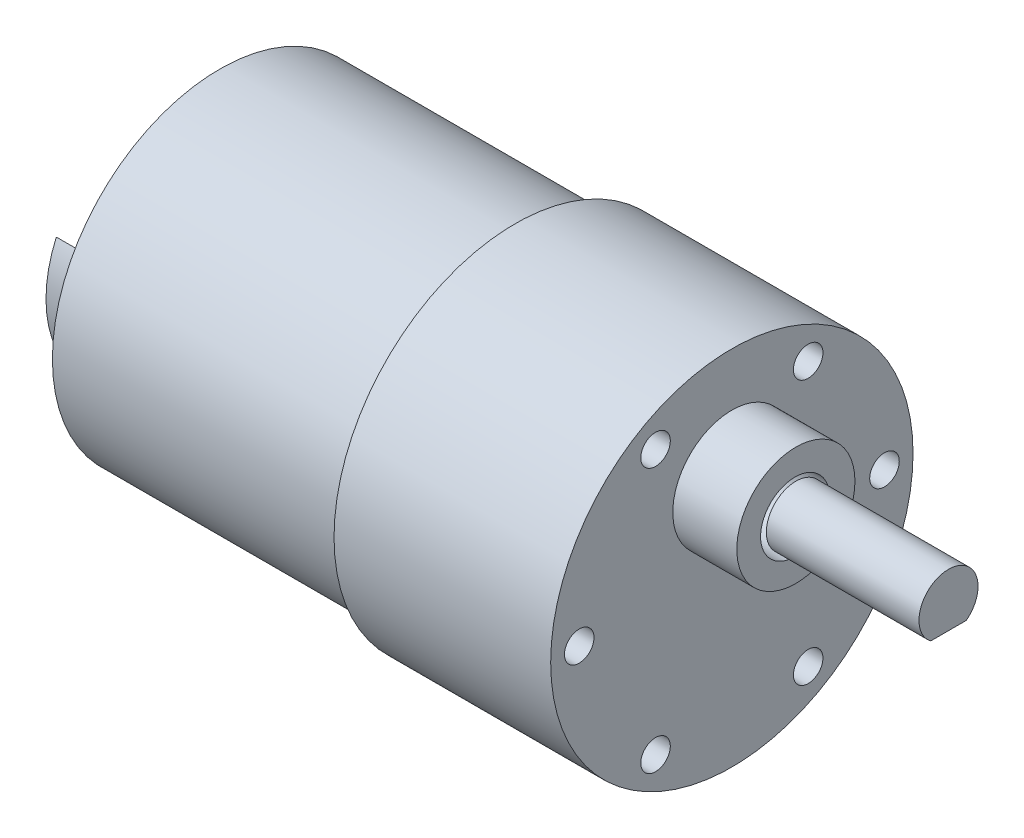
ISO-10303-21;
HEADER;
FILE_DESCRIPTION(('STEP AP214'),'2;1');
FILE_NAME('part.step','',(''),(''),'','','');
FILE_SCHEMA(('AUTOMOTIVE_DESIGN { 1 0 10303 214 1 1 1 1 }'));
ENDSEC;
DATA;
#1=APPLICATION_CONTEXT('core data for automotive mechanical design processes');
#2=APPLICATION_PROTOCOL_DEFINITION('international standard','automotive_design',2000,#1);
#3=PRODUCT_CONTEXT('',#1,'mechanical');
#4=PRODUCT('Part','Part','',(#3));
#5=PRODUCT_RELATED_PRODUCT_CATEGORY('part','',(#4));
#6=PRODUCT_DEFINITION_FORMATION('','',#4);
#7=PRODUCT_DEFINITION_CONTEXT('part definition',#1,'design');
#8=PRODUCT_DEFINITION('design','',#6,#7);
#9=PRODUCT_DEFINITION_SHAPE('','',#8);
#10=(LENGTH_UNIT() NAMED_UNIT(*) SI_UNIT(.MILLI.,.METRE.));
#11=(NAMED_UNIT(*) PLANE_ANGLE_UNIT() SI_UNIT($,.RADIAN.));
#12=(NAMED_UNIT(*) SI_UNIT($,.STERADIAN.) SOLID_ANGLE_UNIT());
#13=UNCERTAINTY_MEASURE_WITH_UNIT(LENGTH_MEASURE(1.E-05),#10,'distance_accuracy_value','');
#14=(GEOMETRIC_REPRESENTATION_CONTEXT(3) GLOBAL_UNCERTAINTY_ASSIGNED_CONTEXT((#13)) GLOBAL_UNIT_ASSIGNED_CONTEXT((#10,
#11,#12)) REPRESENTATION_CONTEXT('',''));
#15=CARTESIAN_POINT('',(0.,0.,0.));
#16=DIRECTION('',(0.,0.,1.));
#17=DIRECTION('',(1.,0.,0.));
#18=AXIS2_PLACEMENT_3D('',#15,#16,#17);
#19=CARTESIAN_POINT('',(6.5,7.,0.));
#20=DIRECTION('',(1.,0.,0.));
#21=DIRECTION('',(0.,0.,-1.));
#22=AXIS2_PLACEMENT_3D('',#19,#20,#21);
#23=PLANE('',#22);
#24=CARTESIAN_POINT('',(6.5,6.90910007875445,0.0865258299453942));
#25=DIRECTION('',(1.,0.,0.));
#26=DIRECTION('',(0.,0.,-1.));
#27=AXIS2_PLACEMENT_3D('',#24,#25,#26);
#28=CIRCLE('',#27,3.5);
#29=CARTESIAN_POINT('',(6.5,6.90910007875445,-3.41347417005461));
#30=VERTEX_POINT('',#29);
#31=EDGE_CURVE('E54',#30,#30,#28,.T.);
#32=ORIENTED_EDGE('',*,*,#31,.F.);
#33=EDGE_LOOP('',(#32));
#34=FACE_BOUND('',#33,.T.);
#35=CARTESIAN_POINT('',(6.5,7.,0.));
#36=DIRECTION('',(1.,0.,0.));
#37=DIRECTION('',(0.,0.,-1.));
#38=AXIS2_PLACEMENT_3D('',#35,#36,#37);
#39=CIRCLE('',#38,6.);
#40=CARTESIAN_POINT('',(6.5,7.,-6.));
#41=VERTEX_POINT('',#40);
#42=EDGE_CURVE('E131',#41,#41,#39,.T.);
#43=ORIENTED_EDGE('',*,*,#42,.T.);
#44=EDGE_LOOP('',(#43));
#45=FACE_BOUND('',#44,.T.);
#46=ADVANCED_FACE('F45',(#34,#45),#23,.T.);
#47=CARTESIAN_POINT('',(0.,0.,0.));
#48=DIRECTION('',(1.,0.,0.));
#49=DIRECTION('',(0.,0.,-1.));
#50=AXIS2_PLACEMENT_3D('',#47,#48,#49);
#51=PLANE('',#50);
#52=CARTESIAN_POINT('',(0.,0.,-15.5));
#53=DIRECTION('',(1.,0.,0.));
#54=DIRECTION('',(0.,0.,-1.));
#55=AXIS2_PLACEMENT_3D('',#52,#53,#54);
#56=CIRCLE('',#55,1.49999999999999);
#57=CARTESIAN_POINT('',(0.,0.,-17.));
#58=VERTEX_POINT('',#57);
#59=EDGE_CURVE('E166',#58,#58,#56,.T.);
#60=ORIENTED_EDGE('',*,*,#59,.F.);
#61=EDGE_LOOP('',(#60));
#62=FACE_BOUND('',#61,.T.);
#63=CARTESIAN_POINT('',(0.,-13.4233937586588,7.75));
#64=DIRECTION('',(1.,0.,0.));
#65=DIRECTION('',(0.,0.,-1.));
#66=AXIS2_PLACEMENT_3D('',#63,#64,#65);
#67=CIRCLE('',#66,1.49999999999999);
#68=CARTESIAN_POINT('',(0.,-13.4233937586588,6.25000000000001));
#69=VERTEX_POINT('',#68);
#70=EDGE_CURVE('E160',#69,#69,#67,.T.);
#71=ORIENTED_EDGE('',*,*,#70,.F.);
#72=EDGE_LOOP('',(#71));
#73=FACE_BOUND('',#72,.T.);
#74=CARTESIAN_POINT('',(0.,13.4233937586588,7.74999999999999));
#75=DIRECTION('',(1.,0.,0.));
#76=DIRECTION('',(0.,0.,-1.));
#77=AXIS2_PLACEMENT_3D('',#74,#75,#76);
#78=CIRCLE('',#77,1.49999999999999);
#79=CARTESIAN_POINT('',(0.,13.4233937586588,6.25));
#80=VERTEX_POINT('',#79);
#81=EDGE_CURVE('E154',#80,#80,#78,.T.);
#82=ORIENTED_EDGE('',*,*,#81,.F.);
#83=EDGE_LOOP('',(#82));
#84=FACE_BOUND('',#83,.T.);
#85=CARTESIAN_POINT('',(0.,-13.4233937586588,-7.75));
#86=DIRECTION('',(1.,0.,0.));
#87=DIRECTION('',(0.,0.,-1.));
#88=AXIS2_PLACEMENT_3D('',#85,#86,#87);
#89=CIRCLE('',#88,1.49999999999999);
#90=CARTESIAN_POINT('',(0.,-13.4233937586588,-9.24999999999999));
#91=VERTEX_POINT('',#90);
#92=EDGE_CURVE('E148',#91,#91,#89,.T.);
#93=ORIENTED_EDGE('',*,*,#92,.F.);
#94=EDGE_LOOP('',(#93));
#95=FACE_BOUND('',#94,.T.);
#96=CARTESIAN_POINT('',(0.,13.4233937586588,-7.75000000000001));
#97=DIRECTION('',(1.,0.,0.));
#98=DIRECTION('',(0.,0.,-1.));
#99=AXIS2_PLACEMENT_3D('',#96,#97,#98);
#100=CIRCLE('',#99,1.49999999999999);
#101=CARTESIAN_POINT('',(0.,13.4233937586588,-9.25));
#102=VERTEX_POINT('',#101);
#103=EDGE_CURVE('E142',#102,#102,#100,.T.);
#104=ORIENTED_EDGE('',*,*,#103,.F.);
#105=EDGE_LOOP('',(#104));
#106=FACE_BOUND('',#105,.T.);
#107=CARTESIAN_POINT('',(0.,0.,15.5));
#108=DIRECTION('',(1.,0.,0.));
#109=DIRECTION('',(0.,0.,-1.));
#110=AXIS2_PLACEMENT_3D('',#107,#108,#109);
#111=CIRCLE('',#110,1.49999999999999);
#112=CARTESIAN_POINT('',(0.,0.,14.));
#113=VERTEX_POINT('',#112);
#114=EDGE_CURVE('E136',#113,#113,#111,.T.);
#115=ORIENTED_EDGE('',*,*,#114,.F.);
#116=EDGE_LOOP('',(#115));
#117=FACE_BOUND('',#116,.T.);
#118=CARTESIAN_POINT('',(0.,0.,0.));
#119=DIRECTION('',(1.,0.,0.));
#120=DIRECTION('',(0.,0.,-1.));
#121=AXIS2_PLACEMENT_3D('',#118,#119,#120);
#122=CIRCLE('',#121,18.4);
#123=CARTESIAN_POINT('',(0.,0.,-18.4));
#124=VERTEX_POINT('',#123);
#125=EDGE_CURVE('E117',#124,#124,#122,.T.);
#126=ORIENTED_EDGE('',*,*,#125,.T.);
#127=EDGE_LOOP('',(#126));
#128=FACE_BOUND('',#127,.T.);
#129=CARTESIAN_POINT('',(0.,7.,0.));
#130=DIRECTION('',(1.,0.,0.));
#131=DIRECTION('',(0.,0.,-1.));
#132=AXIS2_PLACEMENT_3D('',#129,#130,#131);
#133=CIRCLE('',#132,6.);
#134=CARTESIAN_POINT('',(0.,7.,-6.));
#135=VERTEX_POINT('',#134);
#136=EDGE_CURVE('E126',#135,#135,#133,.T.);
#137=ORIENTED_EDGE('',*,*,#136,.F.);
#138=EDGE_LOOP('',(#137));
#139=FACE_BOUND('',#138,.T.);
#140=ADVANCED_FACE('F175',(#62,#73,#84,#95,#106,#117,#128,#139),#51,.T.);
#141=CARTESIAN_POINT('',(-53.,0.,0.));
#142=DIRECTION('',(-1.,0.,0.));
#143=DIRECTION('',(0.,0.,1.));
#144=AXIS2_PLACEMENT_3D('',#141,#142,#143);
#145=PLANE('',#144);
#146=CARTESIAN_POINT('',(-53.,0.,0.));
#147=DIRECTION('',(-1.,0.,0.));
#148=DIRECTION('',(0.,0.,1.));
#149=AXIS2_PLACEMENT_3D('',#146,#147,#148);
#150=CIRCLE('',#149,12.05);
#151=CARTESIAN_POINT('',(-53.,4.91960364257121,11.));
#152=VERTEX_POINT('',#151);
#153=CARTESIAN_POINT('',(-53.,4.9196036425712,-11.));
#154=VERTEX_POINT('',#153);
#155=EDGE_CURVE('E114',#152,#154,#150,.T.);
#156=ORIENTED_EDGE('',*,*,#155,.T.);
#157=DIRECTION('',(0.,1.,0.));
#158=VECTOR('',#157,1.);
#159=CARTESIAN_POINT('',(-53.,4.9196036425712,-11.));
#160=LINE('',#159,#158);
#161=CARTESIAN_POINT('',(-53.,-4.91960364257119,-11.));
#162=VERTEX_POINT('',#161);
#163=EDGE_CURVE('E92',#162,#154,#160,.T.);
#164=ORIENTED_EDGE('',*,*,#163,.F.);
#165=CARTESIAN_POINT('',(-53.,-4.91960364257122,11.));
#166=VERTEX_POINT('',#165);
#167=EDGE_CURVE('E113',#162,#166,#150,.T.);
#168=ORIENTED_EDGE('',*,*,#167,.T.);
#169=DIRECTION('',(0.,1.,0.));
#170=VECTOR('',#169,1.);
#171=CARTESIAN_POINT('',(-53.,-4.91960364257122,11.));
#172=LINE('',#171,#170);
#173=EDGE_CURVE('E88',#166,#152,#172,.T.);
#174=ORIENTED_EDGE('',*,*,#173,.T.);
#175=EDGE_LOOP('',(#156,#164,#168,#174));
#176=FACE_BOUND('',#175,.T.);
#177=ADVANCED_FACE('F188',(#176),#145,.T.);
#178=CARTESIAN_POINT('',(-52.,0.,0.));
#179=DIRECTION('',(-1.,0.,0.));
#180=DIRECTION('',(0.,0.,1.));
#181=AXIS2_PLACEMENT_3D('',#178,#179,#180);
#182=PLANE('',#181);
#183=CARTESIAN_POINT('',(-52.,0.,0.));
#184=DIRECTION('',(-1.,0.,0.));
#185=DIRECTION('',(0.,0.,1.));
#186=AXIS2_PLACEMENT_3D('',#183,#184,#185);
#187=CIRCLE('',#186,17.);
#188=CARTESIAN_POINT('',(-52.,0.,17.));
#189=VERTEX_POINT('',#188);
#190=EDGE_CURVE('E112',#189,#189,#187,.T.);
#191=ORIENTED_EDGE('',*,*,#190,.T.);
#192=EDGE_LOOP('',(#191));
#193=FACE_BOUND('',#192,.T.);
#194=CARTESIAN_POINT('',(-52.,0.,0.));
#195=DIRECTION('',(-1.,0.,0.));
#196=DIRECTION('',(0.,0.,1.));
#197=AXIS2_PLACEMENT_3D('',#194,#195,#196);
#198=CIRCLE('',#197,12.05);
#199=CARTESIAN_POINT('',(-52.,0.,12.05));
#200=VERTEX_POINT('',#199);
#201=EDGE_CURVE('E103',#200,#200,#198,.T.);
#202=ORIENTED_EDGE('',*,*,#201,.F.);
#203=EDGE_LOOP('',(#202));
#204=FACE_BOUND('',#203,.T.);
#205=ADVANCED_FACE('F194',(#193,#204),#182,.T.);
#206=CARTESIAN_POINT('',(-22.,18.4,0.));
#207=DIRECTION('',(-1.,0.,0.));
#208=DIRECTION('',(0.,0.,1.));
#209=AXIS2_PLACEMENT_3D('',#206,#207,#208);
#210=PLANE('',#209);
#211=CARTESIAN_POINT('',(-22.,0.,0.));
#212=DIRECTION('',(1.,0.,0.));
#213=DIRECTION('',(0.,0.,-1.));
#214=AXIS2_PLACEMENT_3D('',#211,#212,#213);
#215=CIRCLE('',#214,18.4);
#216=CARTESIAN_POINT('',(-22.,0.,-18.4));
#217=VERTEX_POINT('',#216);
#218=EDGE_CURVE('E442',#217,#217,#215,.T.);
#219=ORIENTED_EDGE('',*,*,#218,.F.);
#220=EDGE_LOOP('',(#219));
#221=FACE_BOUND('',#220,.T.);
#222=CARTESIAN_POINT('',(-22.,0.,0.));
#223=DIRECTION('',(-1.,0.,0.));
#224=DIRECTION('',(0.,0.,1.));
#225=AXIS2_PLACEMENT_3D('',#222,#223,#224);
#226=CIRCLE('',#225,17.);
#227=CARTESIAN_POINT('',(-22.,0.,17.));
#228=VERTEX_POINT('',#227);
#229=EDGE_CURVE('E123',#228,#228,#226,.T.);
#230=ORIENTED_EDGE('',*,*,#229,.F.);
#231=EDGE_LOOP('',(#230));
#232=FACE_BOUND('',#231,.T.);
#233=ADVANCED_FACE('F201',(#221,#232),#210,.T.);
#234=CARTESIAN_POINT('',(-22.,0.,0.));
#235=DIRECTION('',(1.,0.,0.));
#236=DIRECTION('',(0.,0.,-1.));
#237=AXIS2_PLACEMENT_3D('',#234,#235,#236);
#238=CYLINDRICAL_SURFACE('',#237,18.4);
#239=ORIENTED_EDGE('',*,*,#218,.T.);
#240=EDGE_LOOP('',(#239));
#241=FACE_BOUND('',#240,.T.);
#242=ORIENTED_EDGE('',*,*,#125,.F.);
#243=EDGE_LOOP('',(#242));
#244=FACE_BOUND('',#243,.T.);
#245=ADVANCED_FACE('F206',(#241,#244),#238,.T.);
#246=CARTESIAN_POINT('',(-52.,0.,0.));
#247=DIRECTION('',(1.,0.,0.));
#248=DIRECTION('',(0.,0.,-1.));
#249=AXIS2_PLACEMENT_3D('',#246,#247,#248);
#250=CYLINDRICAL_SURFACE('',#249,17.);
#251=ORIENTED_EDGE('',*,*,#190,.F.);
#252=EDGE_LOOP('',(#251));
#253=FACE_BOUND('',#252,.T.);
#254=ORIENTED_EDGE('',*,*,#229,.T.);
#255=EDGE_LOOP('',(#254));
#256=FACE_BOUND('',#255,.T.);
#257=ADVANCED_FACE('F203',(#253,#256),#250,.T.);
#258=CARTESIAN_POINT('',(-57.6,0.,0.));
#259=DIRECTION('',(1.,0.,0.));
#260=DIRECTION('',(0.,0.,-1.));
#261=AXIS2_PLACEMENT_3D('',#258,#259,#260);
#262=CYLINDRICAL_SURFACE('',#261,12.05);
#263=CARTESIAN_POINT('',(-57.6,0.,0.));
#264=DIRECTION('',(-1.,0.,0.));
#265=DIRECTION('',(0.,0.,1.));
#266=AXIS2_PLACEMENT_3D('',#263,#264,#265);
#267=CIRCLE('',#266,12.05);
#268=CARTESIAN_POINT('',(-57.6,-4.91960364257122,11.));
#269=VERTEX_POINT('',#268);
#270=CARTESIAN_POINT('',(-57.6,4.91960364257121,11.));
#271=VERTEX_POINT('',#270);
#272=EDGE_CURVE('E97',#269,#271,#267,.T.);
#273=ORIENTED_EDGE('',*,*,#272,.F.);
#274=DIRECTION('',(-1.,0.,0.));
#275=VECTOR('',#274,1.);
#276=CARTESIAN_POINT('',(-53.,-4.91960364257122,11.));
#277=LINE('',#276,#275);
#278=EDGE_CURVE('E82',#166,#269,#277,.T.);
#279=ORIENTED_EDGE('',*,*,#278,.F.);
#280=ORIENTED_EDGE('',*,*,#167,.F.);
#281=DIRECTION('',(1.,0.,0.));
#282=VECTOR('',#281,1.);
#283=CARTESIAN_POINT('',(-57.6,-4.9196036425712,-11.));
#284=LINE('',#283,#282);
#285=CARTESIAN_POINT('',(-57.6,-4.9196036425712,-11.));
#286=VERTEX_POINT('',#285);
#287=EDGE_CURVE('E118',#286,#162,#284,.T.);
#288=ORIENTED_EDGE('',*,*,#287,.F.);
#289=CARTESIAN_POINT('',(-57.6,0.,0.));
#290=DIRECTION('',(-1.,0.,0.));
#291=DIRECTION('',(0.,0.,-1.));
#292=AXIS2_PLACEMENT_3D('',#289,#290,#291);
#293=CIRCLE('',#292,12.05);
#294=CARTESIAN_POINT('',(-57.6,4.9196036425712,-11.));
#295=VERTEX_POINT('',#294);
#296=EDGE_CURVE('E120',#295,#286,#293,.T.);
#297=ORIENTED_EDGE('',*,*,#296,.F.);
#298=DIRECTION('',(1.,0.,0.));
#299=VECTOR('',#298,1.);
#300=CARTESIAN_POINT('',(-57.6,4.9196036425712,-11.));
#301=LINE('',#300,#299);
#302=EDGE_CURVE('E109',#295,#154,#301,.T.);
#303=ORIENTED_EDGE('',*,*,#302,.T.);
#304=ORIENTED_EDGE('',*,*,#155,.F.);
#305=DIRECTION('',(-1.,0.,0.));
#306=VECTOR('',#305,1.);
#307=CARTESIAN_POINT('',(-53.,4.91960364257121,11.));
#308=LINE('',#307,#306);
#309=EDGE_CURVE('E102',#152,#271,#308,.T.);
#310=ORIENTED_EDGE('',*,*,#309,.T.);
#311=EDGE_LOOP('',(#273,#279,#280,#288,#297,#303,#304,#310));
#312=FACE_BOUND('',#311,.T.);
#313=ORIENTED_EDGE('',*,*,#201,.T.);
#314=EDGE_LOOP('',(#313));
#315=FACE_BOUND('',#314,.T.);
#316=ADVANCED_FACE('F99',(#312,#315),#262,.T.);
#317=CARTESIAN_POINT('',(-57.6,0.,0.));
#318=DIRECTION('',(-1.,0.,0.));
#319=DIRECTION('',(0.,0.,1.));
#320=AXIS2_PLACEMENT_3D('',#317,#318,#319);
#321=PLANE('',#320);
#322=DIRECTION('',(0.,1.,0.));
#323=VECTOR('',#322,1.);
#324=CARTESIAN_POINT('',(-57.6,-4.91960364257122,11.));
#325=LINE('',#324,#323);
#326=EDGE_CURVE('E85',#269,#271,#325,.T.);
#327=ORIENTED_EDGE('',*,*,#326,.F.);
#328=ORIENTED_EDGE('',*,*,#272,.T.);
#329=EDGE_LOOP('',(#327,#328));
#330=FACE_BOUND('',#329,.T.);
#331=ADVANCED_FACE('F96',(#330),#321,.T.);
#332=CARTESIAN_POINT('',(-53.,-4.91960364257122,11.));
#333=DIRECTION('',(0.,0.,1.));
#334=DIRECTION('',(0.,-1.,0.));
#335=AXIS2_PLACEMENT_3D('',#332,#333,#334);
#336=PLANE('',#335);
#337=ORIENTED_EDGE('',*,*,#326,.T.);
#338=ORIENTED_EDGE('',*,*,#309,.F.);
#339=ORIENTED_EDGE('',*,*,#173,.F.);
#340=ORIENTED_EDGE('',*,*,#278,.T.);
#341=EDGE_LOOP('',(#337,#338,#339,#340));
#342=FACE_BOUND('',#341,.T.);
#343=ADVANCED_FACE('F84',(#342),#336,.F.);
#344=CARTESIAN_POINT('',(-57.6,4.9196036425712,-11.));
#345=DIRECTION('',(0.,0.,-1.));
#346=DIRECTION('',(0.,1.,0.));
#347=AXIS2_PLACEMENT_3D('',#344,#345,#346);
#348=PLANE('',#347);
#349=ORIENTED_EDGE('',*,*,#163,.T.);
#350=ORIENTED_EDGE('',*,*,#302,.F.);
#351=DIRECTION('',(0.,1.,0.));
#352=VECTOR('',#351,1.);
#353=CARTESIAN_POINT('',(-57.6,4.9196036425712,-11.));
#354=LINE('',#353,#352);
#355=EDGE_CURVE('E60',#286,#295,#354,.T.);
#356=ORIENTED_EDGE('',*,*,#355,.F.);
#357=ORIENTED_EDGE('',*,*,#287,.T.);
#358=EDGE_LOOP('',(#349,#350,#356,#357));
#359=FACE_BOUND('',#358,.T.);
#360=ADVANCED_FACE('F216',(#359),#348,.F.);
#361=CARTESIAN_POINT('',(-57.6,0.,0.));
#362=DIRECTION('',(1.,0.,0.));
#363=DIRECTION('',(0.,0.,-1.));
#364=AXIS2_PLACEMENT_3D('',#361,#362,#363);
#365=PLANE('',#364);
#366=ORIENTED_EDGE('',*,*,#296,.T.);
#367=ORIENTED_EDGE('',*,*,#355,.T.);
#368=EDGE_LOOP('',(#366,#367));
#369=FACE_BOUND('',#368,.T.);
#370=ADVANCED_FACE('F183',(#369),#365,.F.);
#371=CARTESIAN_POINT('',(6.5,7.,0.));
#372=DIRECTION('',(-1.,0.,0.));
#373=DIRECTION('',(0.,0.,1.));
#374=AXIS2_PLACEMENT_3D('',#371,#372,#373);
#375=CYLINDRICAL_SURFACE('',#374,6.);
#376=ORIENTED_EDGE('',*,*,#42,.F.);
#377=EDGE_LOOP('',(#376));
#378=FACE_BOUND('',#377,.T.);
#379=ORIENTED_EDGE('',*,*,#136,.T.);
#380=EDGE_LOOP('',(#379));
#381=FACE_BOUND('',#380,.T.);
#382=ADVANCED_FACE('F179',(#378,#381),#375,.T.);
#383=CARTESIAN_POINT('',(-4.,0.,15.5));
#384=DIRECTION('',(-1.,0.,0.));
#385=DIRECTION('',(0.,0.,1.));
#386=AXIS2_PLACEMENT_3D('',#383,#384,#385);
#387=PLANE('',#386);
#388=CARTESIAN_POINT('',(-4.,0.,15.5));
#389=DIRECTION('',(1.,0.,0.));
#390=DIRECTION('',(0.,0.,-1.));
#391=AXIS2_PLACEMENT_3D('',#388,#389,#390);
#392=CIRCLE('',#391,1.49999999999999);
#393=CARTESIAN_POINT('',(-4.,0.,14.));
#394=VERTEX_POINT('',#393);
#395=EDGE_CURVE('E130',#394,#394,#392,.T.);
#396=ORIENTED_EDGE('',*,*,#395,.T.);
#397=EDGE_LOOP('',(#396));
#398=FACE_BOUND('',#397,.T.);
#399=ADVANCED_FACE('F182',(#398),#387,.F.);
#400=CARTESIAN_POINT('',(0.,0.,15.5));
#401=DIRECTION('',(1.,0.,0.));
#402=DIRECTION('',(0.,0.,-1.));
#403=AXIS2_PLACEMENT_3D('',#400,#401,#402);
#404=CYLINDRICAL_SURFACE('',#403,1.49999999999999);
#405=ORIENTED_EDGE('',*,*,#395,.F.);
#406=EDGE_LOOP('',(#405));
#407=FACE_BOUND('',#406,.T.);
#408=ORIENTED_EDGE('',*,*,#114,.T.);
#409=EDGE_LOOP('',(#408));
#410=FACE_BOUND('',#409,.T.);
#411=ADVANCED_FACE('F225',(#407,#410),#404,.F.);
#412=CARTESIAN_POINT('',(-4.,13.4233937586588,-7.75000000000001));
#413=DIRECTION('',(-1.,0.,0.));
#414=DIRECTION('',(0.,0.,1.));
#415=AXIS2_PLACEMENT_3D('',#412,#413,#414);
#416=PLANE('',#415);
#417=CARTESIAN_POINT('',(-4.,13.4233937586588,-7.75000000000001));
#418=DIRECTION('',(1.,0.,0.));
#419=DIRECTION('',(0.,0.,-1.));
#420=AXIS2_PLACEMENT_3D('',#417,#418,#419);
#421=CIRCLE('',#420,1.49999999999999);
#422=CARTESIAN_POINT('',(-4.,13.4233937586588,-9.24999999999999));
#423=VERTEX_POINT('',#422);
#424=EDGE_CURVE('E139',#423,#423,#421,.T.);
#425=ORIENTED_EDGE('',*,*,#424,.T.);
#426=EDGE_LOOP('',(#425));
#427=FACE_BOUND('',#426,.T.);
#428=ADVANCED_FACE('F229',(#427),#416,.F.);
#429=CARTESIAN_POINT('',(0.,13.4233937586588,-7.75000000000001));
#430=DIRECTION('',(1.,0.,0.));
#431=DIRECTION('',(0.,0.,-1.));
#432=AXIS2_PLACEMENT_3D('',#429,#430,#431);
#433=CYLINDRICAL_SURFACE('',#432,1.49999999999999);
#434=ORIENTED_EDGE('',*,*,#424,.F.);
#435=EDGE_LOOP('',(#434));
#436=FACE_BOUND('',#435,.T.);
#437=ORIENTED_EDGE('',*,*,#103,.T.);
#438=EDGE_LOOP('',(#437));
#439=FACE_BOUND('',#438,.T.);
#440=ADVANCED_FACE('F233',(#436,#439),#433,.F.);
#441=CARTESIAN_POINT('',(-4.,-13.4233937586588,-7.75));
#442=DIRECTION('',(-1.,0.,0.));
#443=DIRECTION('',(0.,0.,1.));
#444=AXIS2_PLACEMENT_3D('',#441,#442,#443);
#445=PLANE('',#444);
#446=CARTESIAN_POINT('',(-4.,-13.4233937586588,-7.75));
#447=DIRECTION('',(1.,0.,0.));
#448=DIRECTION('',(0.,0.,-1.));
#449=AXIS2_PLACEMENT_3D('',#446,#447,#448);
#450=CIRCLE('',#449,1.49999999999999);
#451=CARTESIAN_POINT('',(-4.,-13.4233937586588,-9.24999999999999));
#452=VERTEX_POINT('',#451);
#453=EDGE_CURVE('E145',#452,#452,#450,.T.);
#454=ORIENTED_EDGE('',*,*,#453,.T.);
#455=EDGE_LOOP('',(#454));
#456=FACE_BOUND('',#455,.T.);
#457=ADVANCED_FACE('F237',(#456),#445,.F.);
#458=CARTESIAN_POINT('',(0.,-13.4233937586588,-7.75));
#459=DIRECTION('',(1.,0.,0.));
#460=DIRECTION('',(0.,0.,-1.));
#461=AXIS2_PLACEMENT_3D('',#458,#459,#460);
#462=CYLINDRICAL_SURFACE('',#461,1.49999999999999);
#463=ORIENTED_EDGE('',*,*,#453,.F.);
#464=EDGE_LOOP('',(#463));
#465=FACE_BOUND('',#464,.T.);
#466=ORIENTED_EDGE('',*,*,#92,.T.);
#467=EDGE_LOOP('',(#466));
#468=FACE_BOUND('',#467,.T.);
#469=ADVANCED_FACE('F241',(#465,#468),#462,.F.);
#470=CARTESIAN_POINT('',(-4.,13.4233937586588,7.74999999999999));
#471=DIRECTION('',(-1.,0.,0.));
#472=DIRECTION('',(0.,0.,1.));
#473=AXIS2_PLACEMENT_3D('',#470,#471,#472);
#474=PLANE('',#473);
#475=CARTESIAN_POINT('',(-4.,13.4233937586588,7.74999999999999));
#476=DIRECTION('',(1.,0.,0.));
#477=DIRECTION('',(0.,0.,-1.));
#478=AXIS2_PLACEMENT_3D('',#475,#476,#477);
#479=CIRCLE('',#478,1.49999999999999);
#480=CARTESIAN_POINT('',(-4.,13.4233937586588,6.25000000000001));
#481=VERTEX_POINT('',#480);
#482=EDGE_CURVE('E151',#481,#481,#479,.T.);
#483=ORIENTED_EDGE('',*,*,#482,.T.);
#484=EDGE_LOOP('',(#483));
#485=FACE_BOUND('',#484,.T.);
#486=ADVANCED_FACE('F245',(#485),#474,.F.);
#487=CARTESIAN_POINT('',(0.,13.4233937586588,7.74999999999999));
#488=DIRECTION('',(1.,0.,0.));
#489=DIRECTION('',(0.,0.,-1.));
#490=AXIS2_PLACEMENT_3D('',#487,#488,#489);
#491=CYLINDRICAL_SURFACE('',#490,1.49999999999999);
#492=ORIENTED_EDGE('',*,*,#482,.F.);
#493=EDGE_LOOP('',(#492));
#494=FACE_BOUND('',#493,.T.);
#495=ORIENTED_EDGE('',*,*,#81,.T.);
#496=EDGE_LOOP('',(#495));
#497=FACE_BOUND('',#496,.T.);
#498=ADVANCED_FACE('F249',(#494,#497),#491,.F.);
#499=CARTESIAN_POINT('',(-4.,-13.4233937586588,7.75));
#500=DIRECTION('',(-1.,0.,0.));
#501=DIRECTION('',(0.,0.,1.));
#502=AXIS2_PLACEMENT_3D('',#499,#500,#501);
#503=PLANE('',#502);
#504=CARTESIAN_POINT('',(-4.,-13.4233937586588,7.75));
#505=DIRECTION('',(1.,0.,0.));
#506=DIRECTION('',(0.,0.,-1.));
#507=AXIS2_PLACEMENT_3D('',#504,#505,#506);
#508=CIRCLE('',#507,1.49999999999999);
#509=CARTESIAN_POINT('',(-4.,-13.4233937586588,6.25000000000001));
#510=VERTEX_POINT('',#509);
#511=EDGE_CURVE('E157',#510,#510,#508,.T.);
#512=ORIENTED_EDGE('',*,*,#511,.T.);
#513=EDGE_LOOP('',(#512));
#514=FACE_BOUND('',#513,.T.);
#515=ADVANCED_FACE('F253',(#514),#503,.F.);
#516=CARTESIAN_POINT('',(0.,-13.4233937586588,7.75));
#517=DIRECTION('',(1.,0.,0.));
#518=DIRECTION('',(0.,0.,-1.));
#519=AXIS2_PLACEMENT_3D('',#516,#517,#518);
#520=CYLINDRICAL_SURFACE('',#519,1.49999999999999);
#521=ORIENTED_EDGE('',*,*,#511,.F.);
#522=EDGE_LOOP('',(#521));
#523=FACE_BOUND('',#522,.T.);
#524=ORIENTED_EDGE('',*,*,#70,.T.);
#525=EDGE_LOOP('',(#524));
#526=FACE_BOUND('',#525,.T.);
#527=ADVANCED_FACE('F257',(#523,#526),#520,.F.);
#528=CARTESIAN_POINT('',(-4.,0.,-15.5));
#529=DIRECTION('',(-1.,0.,0.));
#530=DIRECTION('',(0.,0.,1.));
#531=AXIS2_PLACEMENT_3D('',#528,#529,#530);
#532=PLANE('',#531);
#533=CARTESIAN_POINT('',(-4.,0.,-15.5));
#534=DIRECTION('',(1.,0.,0.));
#535=DIRECTION('',(0.,0.,-1.));
#536=AXIS2_PLACEMENT_3D('',#533,#534,#535);
#537=CIRCLE('',#536,1.49999999999999);
#538=CARTESIAN_POINT('',(-4.,0.,-17.));
#539=VERTEX_POINT('',#538);
#540=EDGE_CURVE('E163',#539,#539,#537,.T.);
#541=ORIENTED_EDGE('',*,*,#540,.T.);
#542=EDGE_LOOP('',(#541));
#543=FACE_BOUND('',#542,.T.);
#544=ADVANCED_FACE('F261',(#543),#532,.F.);
#545=CARTESIAN_POINT('',(0.,0.,-15.5));
#546=DIRECTION('',(1.,0.,0.));
#547=DIRECTION('',(0.,0.,-1.));
#548=AXIS2_PLACEMENT_3D('',#545,#546,#547);
#549=CYLINDRICAL_SURFACE('',#548,1.49999999999999);
#550=ORIENTED_EDGE('',*,*,#540,.F.);
#551=EDGE_LOOP('',(#550));
#552=FACE_BOUND('',#551,.T.);
#553=ORIENTED_EDGE('',*,*,#59,.T.);
#554=EDGE_LOOP('',(#553));
#555=FACE_BOUND('',#554,.T.);
#556=ADVANCED_FACE('F265',(#552,#555),#549,.F.);
#557=CARTESIAN_POINT('',(-8.5,6.90910007875445,0.0865258299453942));
#558=DIRECTION('',(1.,0.,0.));
#559=DIRECTION('',(0.,0.,-1.));
#560=AXIS2_PLACEMENT_3D('',#557,#558,#559);
#561=CYLINDRICAL_SURFACE('',#560,3.5);
#562=CARTESIAN_POINT('',(-8.5,6.90910007875445,0.0865258299453942));
#563=DIRECTION('',(1.,0.,0.));
#564=DIRECTION('',(0.,0.,-1.));
#565=AXIS2_PLACEMENT_3D('',#562,#563,#564);
#566=CIRCLE('',#565,3.5);
#567=CARTESIAN_POINT('',(-8.5,6.90910007875445,-3.41347417005461));
#568=VERTEX_POINT('',#567);
#569=EDGE_CURVE('E12',#568,#568,#566,.T.);
#570=ORIENTED_EDGE('',*,*,#569,.F.);
#571=EDGE_LOOP('',(#570));
#572=FACE_BOUND('',#571,.T.);
#573=ORIENTED_EDGE('',*,*,#31,.T.);
#574=EDGE_LOOP('',(#573));
#575=FACE_BOUND('',#574,.T.);
#576=ADVANCED_FACE('F171',(#572,#575),#561,.F.);
#577=CARTESIAN_POINT('',(-8.5,6.90910007875445,0.0865258299453942));
#578=DIRECTION('',(1.,0.,0.));
#579=DIRECTION('',(0.,0.,-1.));
#580=AXIS2_PLACEMENT_3D('',#577,#578,#579);
#581=PLANE('',#580);
#582=ORIENTED_EDGE('',*,*,#569,.T.);
#583=EDGE_LOOP('',(#582));
#584=FACE_BOUND('',#583,.T.);
#585=ADVANCED_FACE('F47',(#584),#581,.T.);
#586=CLOSED_SHELL('',(#46,#140,#177,#205,#233,#245,#257,#316,#331,#343,#360,#370,#382,#399,#411,
#428,#440,#457,#469,#486,#498,#515,#527,#544,#556,#576,#585));
#587=MANIFOLD_SOLID_BREP('B2',#586);
#588=CARTESIAN_POINT('',(10.,7.,0.));
#589=DIRECTION('',(1.,0.,0.));
#590=DIRECTION('',(0.,0.,-1.));
#591=AXIS2_PLACEMENT_3D('',#588,#589,#590);
#592=PLANE('',#591);
#593=CARTESIAN_POINT('',(10.,7.,0.));
#594=DIRECTION('',(1.,0.,0.));
#595=DIRECTION('',(0.,0.,-1.));
#596=AXIS2_PLACEMENT_3D('',#593,#594,#595);
#597=CIRCLE('',#596,3.);
#598=CARTESIAN_POINT('',(10.,4.6,1.8));
#599=VERTEX_POINT('',#598);
#600=CARTESIAN_POINT('',(10.,4.6,-1.8));
#601=VERTEX_POINT('',#600);
#602=EDGE_CURVE('E515',#599,#601,#597,.T.);
#603=ORIENTED_EDGE('',*,*,#602,.T.);
#604=DIRECTION('',(0.,0.,1.));
#605=VECTOR('',#604,1.);
#606=CARTESIAN_POINT('',(10.,4.6,-1.8));
#607=LINE('',#606,#605);
#608=EDGE_CURVE('E545',#601,#599,#607,.T.);
#609=ORIENTED_EDGE('',*,*,#608,.T.);
#610=EDGE_LOOP('',(#603,#609));
#611=FACE_BOUND('',#610,.T.);
#612=ADVANCED_FACE('F486',(#611),#592,.T.);
#613=CARTESIAN_POINT('',(10.,4.6,-1.8));
#614=DIRECTION('',(0.,1.,0.));
#615=DIRECTION('',(0.,0.,1.));
#616=AXIS2_PLACEMENT_3D('',#613,#614,#615);
#617=PLANE('',#616);
#618=DIRECTION('',(0.,0.,1.));
#619=VECTOR('',#618,1.);
#620=CARTESIAN_POINT('',(22.,4.6,-1.8));
#621=LINE('',#620,#619);
#622=CARTESIAN_POINT('',(22.,4.6,-1.8));
#623=VERTEX_POINT('',#622);
#624=CARTESIAN_POINT('',(22.,4.6,1.8));
#625=VERTEX_POINT('',#624);
#626=EDGE_CURVE('E511',#623,#625,#621,.T.);
#627=ORIENTED_EDGE('',*,*,#626,.T.);
#628=DIRECTION('',(1.,0.,0.));
#629=VECTOR('',#628,1.);
#630=CARTESIAN_POINT('',(10.,4.6,1.8));
#631=LINE('',#630,#629);
#632=EDGE_CURVE('E494',#599,#625,#631,.T.);
#633=ORIENTED_EDGE('',*,*,#632,.F.);
#634=ORIENTED_EDGE('',*,*,#608,.F.);
#635=DIRECTION('',(1.,0.,0.));
#636=VECTOR('',#635,1.);
#637=CARTESIAN_POINT('',(10.,4.6,-1.8));
#638=LINE('',#637,#636);
#639=EDGE_CURVE('E501',#601,#623,#638,.T.);
#640=ORIENTED_EDGE('',*,*,#639,.T.);
#641=EDGE_LOOP('',(#627,#633,#634,#640));
#642=FACE_BOUND('',#641,.T.);
#643=ADVANCED_FACE('F512',(#642),#617,.F.);
#644=CARTESIAN_POINT('',(22.,7.,0.));
#645=DIRECTION('',(1.,0.,0.));
#646=DIRECTION('',(0.,0.,-1.));
#647=AXIS2_PLACEMENT_3D('',#644,#645,#646);
#648=PLANE('',#647);
#649=ORIENTED_EDGE('',*,*,#626,.F.);
#650=CARTESIAN_POINT('',(22.,7.,0.));
#651=DIRECTION('',(1.,0.,0.));
#652=DIRECTION('',(0.,0.,-1.));
#653=AXIS2_PLACEMENT_3D('',#650,#651,#652);
#654=CIRCLE('',#653,3.);
#655=EDGE_CURVE('E43',#623,#625,#654,.T.);
#656=ORIENTED_EDGE('',*,*,#655,.T.);
#657=EDGE_LOOP('',(#649,#656));
#658=FACE_BOUND('',#657,.T.);
#659=ADVANCED_FACE('F522',(#658),#648,.T.);
#660=CARTESIAN_POINT('',(22.,7.,0.));
#661=DIRECTION('',(-1.,0.,0.));
#662=DIRECTION('',(0.,0.,1.));
#663=AXIS2_PLACEMENT_3D('',#660,#661,#662);
#664=CYLINDRICAL_SURFACE('',#663,3.);
#665=ORIENTED_EDGE('',*,*,#655,.F.);
#666=ORIENTED_EDGE('',*,*,#639,.F.);
#667=ORIENTED_EDGE('',*,*,#602,.F.);
#668=ORIENTED_EDGE('',*,*,#632,.T.);
#669=EDGE_LOOP('',(#665,#666,#667,#668));
#670=FACE_BOUND('',#669,.T.);
#671=CARTESIAN_POINT('',(6.5,7.,0.));
#672=DIRECTION('',(1.,0.,0.));
#673=DIRECTION('',(0.,0.,-1.));
#674=AXIS2_PLACEMENT_3D('',#671,#672,#673);
#675=CIRCLE('',#674,3.);
#676=CARTESIAN_POINT('',(6.5,7.,-3.));
#677=VERTEX_POINT('',#676);
#678=EDGE_CURVE('E516',#677,#677,#675,.T.);
#679=ORIENTED_EDGE('',*,*,#678,.T.);
#680=EDGE_LOOP('',(#679));
#681=FACE_BOUND('',#680,.T.);
#682=ADVANCED_FACE('F488',(#670,#681),#664,.T.);
#683=CARTESIAN_POINT('',(6.5,6.90910007875445,0.0865258299453942));
#684=DIRECTION('',(1.,0.,0.));
#685=DIRECTION('',(0.,0.,-1.));
#686=AXIS2_PLACEMENT_3D('',#683,#684,#685);
#687=PLANE('',#686);
#688=ORIENTED_EDGE('',*,*,#678,.F.);
#689=EDGE_LOOP('',(#688));
#690=FACE_BOUND('',#689,.T.);
#691=ADVANCED_FACE('F528',(#690),#687,.F.);
#692=CLOSED_SHELL('',(#612,#643,#659,#682,#691));
#693=MANIFOLD_SOLID_BREP('B6',#692);
#694=ADVANCED_BREP_SHAPE_REPRESENTATION('',(#18,#587,#693),#14);
#695=SHAPE_DEFINITION_REPRESENTATION(#9,#694);
ENDSEC;
END-ISO-10303-21;
